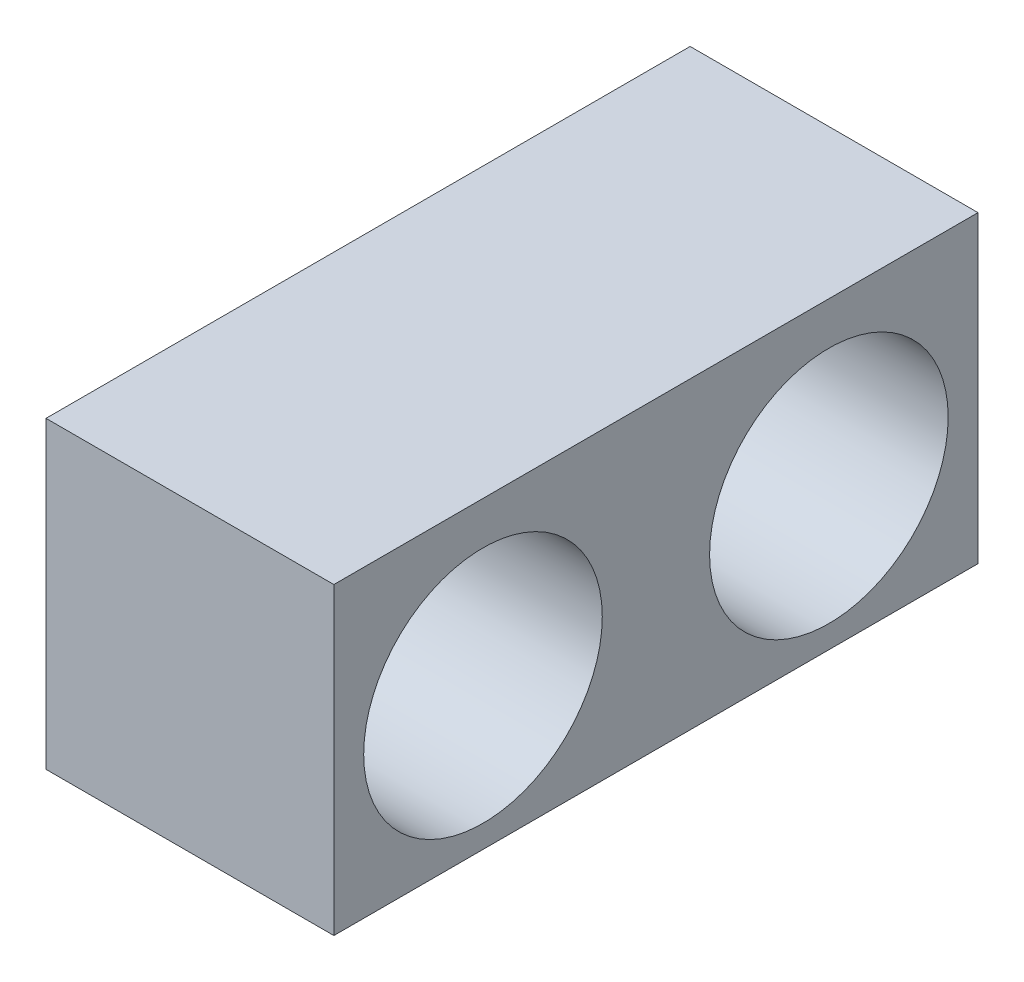
ISO-10303-21;
HEADER;
FILE_DESCRIPTION(('STEP AP214'),'2;1');
FILE_NAME('part.step','',(''),(''),'','','');
FILE_SCHEMA(('AUTOMOTIVE_DESIGN { 1 0 10303 214 1 1 1 1 }'));
ENDSEC;
DATA;
#1=APPLICATION_CONTEXT('core data for automotive mechanical design processes');
#2=APPLICATION_PROTOCOL_DEFINITION('international standard','automotive_design',2000,#1);
#3=PRODUCT_CONTEXT('',#1,'mechanical');
#4=PRODUCT('Part','Part','',(#3));
#5=PRODUCT_RELATED_PRODUCT_CATEGORY('part','',(#4));
#6=PRODUCT_DEFINITION_FORMATION('','',#4);
#7=PRODUCT_DEFINITION_CONTEXT('part definition',#1,'design');
#8=PRODUCT_DEFINITION('design','',#6,#7);
#9=PRODUCT_DEFINITION_SHAPE('','',#8);
#10=(LENGTH_UNIT() NAMED_UNIT(*) SI_UNIT(.MILLI.,.METRE.));
#11=(NAMED_UNIT(*) PLANE_ANGLE_UNIT() SI_UNIT($,.RADIAN.));
#12=(NAMED_UNIT(*) SI_UNIT($,.STERADIAN.) SOLID_ANGLE_UNIT());
#13=UNCERTAINTY_MEASURE_WITH_UNIT(LENGTH_MEASURE(1.E-05),#10,'distance_accuracy_value','');
#14=(GEOMETRIC_REPRESENTATION_CONTEXT(3) GLOBAL_UNCERTAINTY_ASSIGNED_CONTEXT((#13)) GLOBAL_UNIT_ASSIGNED_CONTEXT((#10,
#11,#12)) REPRESENTATION_CONTEXT('',''));
#15=CARTESIAN_POINT('',(0.,0.,0.));
#16=DIRECTION('',(0.,0.,1.));
#17=DIRECTION('',(1.,0.,0.));
#18=AXIS2_PLACEMENT_3D('',#15,#16,#17);
#19=CARTESIAN_POINT('',(0.,0.,0.));
#20=DIRECTION('',(0.,1.,0.));
#21=DIRECTION('',(0.,0.,1.));
#22=AXIS2_PLACEMENT_3D('',#19,#20,#21);
#23=PLANE('',#22);
#24=DIRECTION('',(1.,0.,0.));
#25=VECTOR('',#24,1.);
#26=CARTESIAN_POINT('',(-22.2000000000004,0.,49.6756858019915));
#27=LINE('',#26,#25);
#28=CARTESIAN_POINT('',(-22.2000000000004,0.,49.6756858019915));
#29=VERTEX_POINT('',#28);
#30=CARTESIAN_POINT('',(22.2,0.,49.6756858019916));
#31=VERTEX_POINT('',#30);
#32=EDGE_CURVE('E60',#29,#31,#27,.T.);
#33=ORIENTED_EDGE('',*,*,#32,.F.);
#34=DIRECTION('',(0.,0.,1.));
#35=VECTOR('',#34,1.);
#36=CARTESIAN_POINT('',(-22.2000000000004,0.,49.6756858019915));
#37=LINE('',#36,#35);
#38=CARTESIAN_POINT('',(-22.2000000000004,0.,-49.6756858019915));
#39=VERTEX_POINT('',#38);
#40=EDGE_CURVE('E98',#39,#29,#37,.T.);
#41=ORIENTED_EDGE('',*,*,#40,.F.);
#42=DIRECTION('',(-1.,0.,0.));
#43=VECTOR('',#42,1.);
#44=CARTESIAN_POINT('',(-22.2000000000004,0.,-49.6756858019915));
#45=LINE('',#44,#43);
#46=CARTESIAN_POINT('',(22.2000000000007,0.,-49.6756858019913));
#47=VERTEX_POINT('',#46);
#48=EDGE_CURVE('E93',#47,#39,#45,.T.);
#49=ORIENTED_EDGE('',*,*,#48,.F.);
#50=DIRECTION('',(0.,0.,-1.));
#51=VECTOR('',#50,1.);
#52=CARTESIAN_POINT('',(22.2000000000007,0.,-49.6756858019913));
#53=LINE('',#52,#51);
#54=EDGE_CURVE('E101',#31,#47,#53,.T.);
#55=ORIENTED_EDGE('',*,*,#54,.F.);
#56=EDGE_LOOP('',(#33,#41,#49,#55));
#57=FACE_BOUND('',#56,.T.);
#58=ADVANCED_FACE('F36',(#57),#23,.F.);
#59=CARTESIAN_POINT('',(-22.2000000000004,0.,49.6756858019915));
#60=DIRECTION('',(0.,0.,1.));
#61=DIRECTION('',(1.,0.,0.));
#62=AXIS2_PLACEMENT_3D('',#59,#60,#61);
#63=PLANE('',#62);
#64=DIRECTION('',(1.,0.,0.));
#65=VECTOR('',#64,1.);
#66=CARTESIAN_POINT('',(-22.2000000000004,46.8908443894375,49.6756858019915));
#67=LINE('',#66,#65);
#68=CARTESIAN_POINT('',(-22.2000000000004,46.8908443894375,49.6756858019915));
#69=VERTEX_POINT('',#68);
#70=CARTESIAN_POINT('',(22.2,46.8908443894375,49.6756858019916));
#71=VERTEX_POINT('',#70);
#72=EDGE_CURVE('E52',#69,#71,#67,.T.);
#73=ORIENTED_EDGE('',*,*,#72,.F.);
#74=DIRECTION('',(0.,1.,0.));
#75=VECTOR('',#74,1.);
#76=CARTESIAN_POINT('',(-22.2000000000004,0.,49.6756858019915));
#77=LINE('',#76,#75);
#78=EDGE_CURVE('E12',#29,#69,#77,.T.);
#79=ORIENTED_EDGE('',*,*,#78,.F.);
#80=ORIENTED_EDGE('',*,*,#32,.T.);
#81=DIRECTION('',(0.,1.,0.));
#82=VECTOR('',#81,1.);
#83=CARTESIAN_POINT('',(22.2,0.,49.6756858019916));
#84=LINE('',#83,#82);
#85=EDGE_CURVE('E39',#31,#71,#84,.T.);
#86=ORIENTED_EDGE('',*,*,#85,.T.);
#87=EDGE_LOOP('',(#73,#79,#80,#86));
#88=FACE_BOUND('',#87,.T.);
#89=ADVANCED_FACE('F132',(#88),#63,.T.);
#90=CARTESIAN_POINT('',(-22.2000000000004,0.,49.6756858019915));
#91=DIRECTION('',(-1.,0.,0.));
#92=DIRECTION('',(0.,0.,1.));
#93=AXIS2_PLACEMENT_3D('',#90,#91,#92);
#94=PLANE('',#93);
#95=CARTESIAN_POINT('',(-22.2000000000004,21.8908443894375,-26.6756858019914));
#96=DIRECTION('',(-1.,0.,0.));
#97=DIRECTION('',(0.,0.,1.));
#98=AXIS2_PLACEMENT_3D('',#95,#96,#97);
#99=CIRCLE('',#98,18.3999999999994);
#100=CARTESIAN_POINT('',(-22.2000000000004,21.8908443894375,-8.27568580199201));
#101=VERTEX_POINT('',#100);
#102=EDGE_CURVE('E114',#101,#101,#99,.T.);
#103=ORIENTED_EDGE('',*,*,#102,.F.);
#104=EDGE_LOOP('',(#103));
#105=FACE_BOUND('',#104,.T.);
#106=CARTESIAN_POINT('',(-22.2000000000004,21.8908443894375,26.6756858019916));
#107=DIRECTION('',(-1.,0.,0.));
#108=DIRECTION('',(0.,0.,1.));
#109=AXIS2_PLACEMENT_3D('',#106,#107,#108);
#110=CIRCLE('',#109,18.4000000000006);
#111=CARTESIAN_POINT('',(-22.2000000000004,21.8908443894375,45.0756858019923));
#112=VERTEX_POINT('',#111);
#113=EDGE_CURVE('E108',#112,#112,#110,.T.);
#114=ORIENTED_EDGE('',*,*,#113,.F.);
#115=EDGE_LOOP('',(#114));
#116=FACE_BOUND('',#115,.T.);
#117=DIRECTION('',(0.,0.,1.));
#118=VECTOR('',#117,1.);
#119=CARTESIAN_POINT('',(-22.2000000000004,46.8908443894375,-49.6756858019915));
#120=LINE('',#119,#118);
#121=CARTESIAN_POINT('',(-22.2000000000004,46.8908443894375,-49.6756858019915));
#122=VERTEX_POINT('',#121);
#123=EDGE_CURVE('E80',#122,#69,#120,.T.);
#124=ORIENTED_EDGE('',*,*,#123,.F.);
#125=DIRECTION('',(0.,1.,0.));
#126=VECTOR('',#125,1.);
#127=CARTESIAN_POINT('',(-22.2000000000004,0.,-49.6756858019915));
#128=LINE('',#127,#126);
#129=EDGE_CURVE('E44',#39,#122,#128,.T.);
#130=ORIENTED_EDGE('',*,*,#129,.F.);
#131=ORIENTED_EDGE('',*,*,#40,.T.);
#132=ORIENTED_EDGE('',*,*,#78,.T.);
#133=EDGE_LOOP('',(#124,#130,#131,#132));
#134=FACE_BOUND('',#133,.T.);
#135=ADVANCED_FACE('F87',(#105,#116,#134),#94,.T.);
#136=CARTESIAN_POINT('',(-22.2000000000004,0.,-49.6756858019915));
#137=DIRECTION('',(0.,0.,-1.));
#138=DIRECTION('',(-1.,0.,0.));
#139=AXIS2_PLACEMENT_3D('',#136,#137,#138);
#140=PLANE('',#139);
#141=DIRECTION('',(1.,0.,0.));
#142=VECTOR('',#141,1.);
#143=CARTESIAN_POINT('',(-22.2000000000004,46.8908443894375,-49.6756858019915));
#144=LINE('',#143,#142);
#145=CARTESIAN_POINT('',(22.2,46.8908443894375,-49.6756858019915));
#146=VERTEX_POINT('',#145);
#147=EDGE_CURVE('E77',#122,#146,#144,.T.);
#148=ORIENTED_EDGE('',*,*,#147,.T.);
#149=DIRECTION('',(0.,1.,0.));
#150=VECTOR('',#149,1.);
#151=CARTESIAN_POINT('',(22.2000000000007,0.,-49.6756858019913));
#152=LINE('',#151,#150);
#153=EDGE_CURVE('E95',#47,#146,#152,.T.);
#154=ORIENTED_EDGE('',*,*,#153,.F.);
#155=ORIENTED_EDGE('',*,*,#48,.T.);
#156=ORIENTED_EDGE('',*,*,#129,.T.);
#157=EDGE_LOOP('',(#148,#154,#155,#156));
#158=FACE_BOUND('',#157,.T.);
#159=ADVANCED_FACE('F91',(#158),#140,.T.);
#160=CARTESIAN_POINT('',(22.2000000000007,0.,-49.6756858019913));
#161=DIRECTION('',(1.,0.,0.));
#162=DIRECTION('',(0.,0.,-1.));
#163=AXIS2_PLACEMENT_3D('',#160,#161,#162);
#164=PLANE('',#163);
#165=CARTESIAN_POINT('',(22.2000000000007,21.8908443894375,-26.6756858019914));
#166=DIRECTION('',(-1.,0.,0.));
#167=DIRECTION('',(0.,0.,1.));
#168=AXIS2_PLACEMENT_3D('',#165,#166,#167);
#169=CIRCLE('',#168,18.3999999999994);
#170=CARTESIAN_POINT('',(22.2000000000007,21.8908443894375,-8.27568580199201));
#171=VERTEX_POINT('',#170);
#172=EDGE_CURVE('E111',#171,#171,#169,.T.);
#173=ORIENTED_EDGE('',*,*,#172,.T.);
#174=EDGE_LOOP('',(#173));
#175=FACE_BOUND('',#174,.T.);
#176=CARTESIAN_POINT('',(22.2000000000007,21.8908443894375,26.6756858019916));
#177=DIRECTION('',(-1.,0.,0.));
#178=DIRECTION('',(0.,0.,1.));
#179=AXIS2_PLACEMENT_3D('',#176,#177,#178);
#180=CIRCLE('',#179,18.4000000000006);
#181=CARTESIAN_POINT('',(22.2000000000007,21.8908443894375,45.0756858019923));
#182=VERTEX_POINT('',#181);
#183=EDGE_CURVE('E106',#182,#182,#180,.T.);
#184=ORIENTED_EDGE('',*,*,#183,.T.);
#185=EDGE_LOOP('',(#184));
#186=FACE_BOUND('',#185,.T.);
#187=DIRECTION('',(0.,0.,1.));
#188=VECTOR('',#187,1.);
#189=CARTESIAN_POINT('',(22.2,46.8908443894375,-49.6756858019915));
#190=LINE('',#189,#188);
#191=EDGE_CURVE('E81',#146,#71,#190,.T.);
#192=ORIENTED_EDGE('',*,*,#191,.T.);
#193=ORIENTED_EDGE('',*,*,#85,.F.);
#194=ORIENTED_EDGE('',*,*,#54,.T.);
#195=ORIENTED_EDGE('',*,*,#153,.T.);
#196=EDGE_LOOP('',(#192,#193,#194,#195));
#197=FACE_BOUND('',#196,.T.);
#198=ADVANCED_FACE('F120',(#175,#186,#197),#164,.T.);
#199=CARTESIAN_POINT('',(-22.2000000000004,46.8908443894375,-49.6756858019915));
#200=DIRECTION('',(0.,-1.,0.));
#201=DIRECTION('',(0.,0.,-1.));
#202=AXIS2_PLACEMENT_3D('',#199,#200,#201);
#203=PLANE('',#202);
#204=ORIENTED_EDGE('',*,*,#72,.T.);
#205=ORIENTED_EDGE('',*,*,#191,.F.);
#206=ORIENTED_EDGE('',*,*,#147,.F.);
#207=ORIENTED_EDGE('',*,*,#123,.T.);
#208=EDGE_LOOP('',(#204,#205,#206,#207));
#209=FACE_BOUND('',#208,.T.);
#210=ADVANCED_FACE('F79',(#209),#203,.F.);
#211=CARTESIAN_POINT('',(22.2000000000007,21.8908443894375,26.6756858019916));
#212=DIRECTION('',(-1.,0.,0.));
#213=DIRECTION('',(0.,0.,1.));
#214=AXIS2_PLACEMENT_3D('',#211,#212,#213);
#215=CYLINDRICAL_SURFACE('',#214,18.4000000000006);
#216=CARTESIAN_POINT('',(22.2000000000007,21.8908443894375,45.0756858019923));
#217=CARTESIAN_POINT('',(21.7375000000007,21.8908443894375,45.0756858019923));
#218=CARTESIAN_POINT('',(21.2750000000007,21.8908443894375,45.0756858019923));
#219=CARTESIAN_POINT('',(20.3500000000007,21.8908443894375,45.0756858019923));
#220=CARTESIAN_POINT('',(19.8875000000007,21.8908443894375,45.0756858019923));
#221=CARTESIAN_POINT('',(18.9625000000007,21.8908443894375,45.0756858019923));
#222=CARTESIAN_POINT('',(18.5000000000006,21.8908443894375,45.0756858019923));
#223=CARTESIAN_POINT('',(17.5750000000006,21.8908443894375,45.0756858019923));
#224=CARTESIAN_POINT('',(17.1125000000006,21.8908443894375,45.0756858019923));
#225=CARTESIAN_POINT('',(16.1875000000006,21.8908443894375,45.0756858019923));
#226=CARTESIAN_POINT('',(15.7250000000006,21.8908443894375,45.0756858019923));
#227=CARTESIAN_POINT('',(14.8000000000005,21.8908443894375,45.0756858019923));
#228=CARTESIAN_POINT('',(14.3375000000005,21.8908443894375,45.0756858019923));
#229=CARTESIAN_POINT('',(13.4125000000005,21.8908443894375,45.0756858019923));
#230=CARTESIAN_POINT('',(12.9500000000005,21.8908443894375,45.0756858019923));
#231=CARTESIAN_POINT('',(12.0250000000005,21.8908443894375,45.0756858019923));
#232=CARTESIAN_POINT('',(11.5625000000005,21.8908443894375,45.0756858019923));
#233=CARTESIAN_POINT('',(10.6375000000004,21.8908443894375,45.0756858019923));
#234=CARTESIAN_POINT('',(10.1750000000004,21.8908443894375,45.0756858019923));
#235=CARTESIAN_POINT('',(9.25000000000041,21.8908443894375,45.0756858019923));
#236=CARTESIAN_POINT('',(8.7875000000004,21.8908443894375,45.0756858019923));
#237=CARTESIAN_POINT('',(7.86250000000038,21.8908443894375,45.0756858019923));
#238=CARTESIAN_POINT('',(7.40000000000036,21.8908443894375,45.0756858019923));
#239=CARTESIAN_POINT('',(6.47500000000034,21.8908443894375,45.0756858019923));
#240=CARTESIAN_POINT('',(6.01250000000033,21.8908443894375,45.0756858019923));
#241=CARTESIAN_POINT('',(5.08750000000031,21.8908443894375,45.0756858019923));
#242=CARTESIAN_POINT('',(4.6250000000003,21.8908443894375,45.0756858019923));
#243=CARTESIAN_POINT('',(3.70000000000027,21.8908443894375,45.0756858019923));
#244=CARTESIAN_POINT('',(3.23750000000026,21.8908443894375,45.0756858019923));
#245=CARTESIAN_POINT('',(2.31250000000024,21.8908443894375,45.0756858019923));
#246=CARTESIAN_POINT('',(1.85000000000023,21.8908443894375,45.0756858019923));
#247=CARTESIAN_POINT('',(0.925000000000204,21.8908443894375,45.0756858019923));
#248=CARTESIAN_POINT('',(0.462500000000192,21.8908443894375,45.0756858019923));
#249=CARTESIAN_POINT('',(-0.462499999999831,21.8908443894375,45.0756858019923));
#250=CARTESIAN_POINT('',(-0.924999999999843,21.8908443894375,45.0756858019923));
#251=CARTESIAN_POINT('',(-1.84999999999987,21.8908443894375,45.0756858019923));
#252=CARTESIAN_POINT('',(-2.31249999999988,21.8908443894375,45.0756858019923));
#253=CARTESIAN_POINT('',(-3.2374999999999,21.8908443894375,45.0756858019923));
#254=CARTESIAN_POINT('',(-3.69999999999991,21.8908443894375,45.0756858019923));
#255=CARTESIAN_POINT('',(-4.62499999999993,21.8908443894375,45.0756858019923));
#256=CARTESIAN_POINT('',(-5.08749999999995,21.8908443894375,45.0756858019923));
#257=CARTESIAN_POINT('',(-6.01249999999997,21.8908443894375,45.0756858019923));
#258=CARTESIAN_POINT('',(-6.47499999999998,21.8908443894375,45.0756858019923));
#259=CARTESIAN_POINT('',(-7.40000000000001,21.8908443894375,45.0756858019923));
#260=CARTESIAN_POINT('',(-7.86250000000002,21.8908443894375,45.0756858019923));
#261=CARTESIAN_POINT('',(-8.78750000000004,21.8908443894375,45.0756858019923));
#262=CARTESIAN_POINT('',(-9.25000000000005,21.8908443894375,45.0756858019923));
#263=CARTESIAN_POINT('',(-10.1750000000001,21.8908443894375,45.0756858019923));
#264=CARTESIAN_POINT('',(-10.6375000000001,21.8908443894375,45.0756858019923));
#265=CARTESIAN_POINT('',(-11.5625000000001,21.8908443894375,45.0756858019923));
#266=CARTESIAN_POINT('',(-12.0250000000001,21.8908443894375,45.0756858019923));
#267=CARTESIAN_POINT('',(-12.9500000000001,21.8908443894375,45.0756858019923));
#268=CARTESIAN_POINT('',(-13.4125000000002,21.8908443894375,45.0756858019923));
#269=CARTESIAN_POINT('',(-14.3375000000002,21.8908443894375,45.0756858019923));
#270=CARTESIAN_POINT('',(-14.8000000000002,21.8908443894375,45.0756858019923));
#271=CARTESIAN_POINT('',(-15.7250000000002,21.8908443894375,45.0756858019923));
#272=CARTESIAN_POINT('',(-16.1875000000002,21.8908443894375,45.0756858019923));
#273=CARTESIAN_POINT('',(-17.1125000000003,21.8908443894375,45.0756858019923));
#274=CARTESIAN_POINT('',(-17.5750000000003,21.8908443894375,45.0756858019923));
#275=CARTESIAN_POINT('',(-18.5000000000003,21.8908443894375,45.0756858019923));
#276=CARTESIAN_POINT('',(-18.9625000000003,21.8908443894375,45.0756858019923));
#277=CARTESIAN_POINT('',(-19.8875000000003,21.8908443894375,45.0756858019923));
#278=CARTESIAN_POINT('',(-20.3500000000003,21.8908443894375,45.0756858019923));
#279=CARTESIAN_POINT('',(-21.2750000000004,21.8908443894375,45.0756858019923));
#280=CARTESIAN_POINT('',(-21.7375000000004,21.8908443894375,45.0756858019923));
#281=CARTESIAN_POINT('',(-22.2000000000004,21.8908443894375,45.0756858019923));
#282=B_SPLINE_CURVE_WITH_KNOTS('',3,(#216,#217,#218,#219,#220,#221,#222,#223,#224,#225,#226,
#227,#228,#229,#230,#231,#232,#233,#234,#235,#236,#237,#238,#239,#240,#241,#242,#243,#244,#245,
#246,#247,#248,#249,#250,#251,#252,#253,#254,#255,#256,#257,#258,#259,#260,#261,#262,#263,#264,
#265,#266,#267,#268,#269,#270,#271,#272,#273,#274,#275,#276,#277,#278,#279,#280,#281),
.UNSPECIFIED.,.F.,.F.,(4,2,2,2,2,2,2,2,2,2,2,2,2,2,2,2,2,2,2,2,2,2,2,2,2,2,2,2,2,2,2,2,4),(0.,
1.38750000000004,2.77500000000007,4.16250000000011,5.55000000000014,6.93750000000018,
8.32500000000021,9.71250000000025,11.1000000000003,12.4875000000003,13.8750000000003,
15.2625000000004,16.6500000000004,18.0375000000005,19.4250000000005,20.8125000000005,
22.2000000000006,23.5875000000006,24.9750000000006,26.3625000000007,27.7500000000007,
29.1375000000007,30.5250000000008,31.9125000000008,33.3000000000008,34.6875000000009,
36.0750000000009,37.4625000000009,38.850000000001,40.237500000001,41.6250000000011,
43.0125000000011,44.4000000000011),.UNSPECIFIED.);
#283=EDGE_CURVE('BSEAM126',#182,#112,#282,.T.);
#284=ORIENTED_EDGE('',*,*,#183,.F.);
#285=ORIENTED_EDGE('',*,*,#113,.T.);
#286=ORIENTED_EDGE('',*,*,#283,.T.);
#287=ORIENTED_EDGE('',*,*,#283,.F.);
#288=EDGE_LOOP('',(#284,#286,#285,#287));
#289=FACE_BOUND('',#288,.T.);
#290=ADVANCED_FACE('F126',(#289),#215,.F.);
#291=CARTESIAN_POINT('',(22.2000000000007,21.8908443894375,-26.6756858019914));
#292=DIRECTION('',(-1.,0.,0.));
#293=DIRECTION('',(0.,0.,1.));
#294=AXIS2_PLACEMENT_3D('',#291,#292,#293);
#295=CYLINDRICAL_SURFACE('',#294,18.3999999999994);
#296=CARTESIAN_POINT('',(22.2000000000007,21.8908443894375,-8.27568580199201));
#297=CARTESIAN_POINT('',(21.7375000000007,21.8908443894375,-8.27568580199201));
#298=CARTESIAN_POINT('',(21.2750000000007,21.8908443894375,-8.27568580199201));
#299=CARTESIAN_POINT('',(20.3500000000007,21.8908443894375,-8.27568580199201));
#300=CARTESIAN_POINT('',(19.8875000000007,21.8908443894375,-8.27568580199201));
#301=CARTESIAN_POINT('',(18.9625000000007,21.8908443894375,-8.27568580199201));
#302=CARTESIAN_POINT('',(18.5000000000006,21.8908443894375,-8.27568580199201));
#303=CARTESIAN_POINT('',(17.5750000000006,21.8908443894375,-8.27568580199201));
#304=CARTESIAN_POINT('',(17.1125000000006,21.8908443894375,-8.27568580199201));
#305=CARTESIAN_POINT('',(16.1875000000006,21.8908443894375,-8.27568580199201));
#306=CARTESIAN_POINT('',(15.7250000000006,21.8908443894375,-8.27568580199201));
#307=CARTESIAN_POINT('',(14.8000000000005,21.8908443894375,-8.27568580199201));
#308=CARTESIAN_POINT('',(14.3375000000005,21.8908443894375,-8.27568580199201));
#309=CARTESIAN_POINT('',(13.4125000000005,21.8908443894375,-8.27568580199201));
#310=CARTESIAN_POINT('',(12.9500000000005,21.8908443894375,-8.27568580199201));
#311=CARTESIAN_POINT('',(12.0250000000005,21.8908443894375,-8.27568580199201));
#312=CARTESIAN_POINT('',(11.5625000000005,21.8908443894375,-8.27568580199201));
#313=CARTESIAN_POINT('',(10.6375000000004,21.8908443894375,-8.27568580199201));
#314=CARTESIAN_POINT('',(10.1750000000004,21.8908443894375,-8.27568580199201));
#315=CARTESIAN_POINT('',(9.25000000000041,21.8908443894375,-8.27568580199201));
#316=CARTESIAN_POINT('',(8.7875000000004,21.8908443894375,-8.27568580199201));
#317=CARTESIAN_POINT('',(7.86250000000038,21.8908443894375,-8.27568580199201));
#318=CARTESIAN_POINT('',(7.40000000000036,21.8908443894375,-8.27568580199201));
#319=CARTESIAN_POINT('',(6.47500000000034,21.8908443894375,-8.27568580199201));
#320=CARTESIAN_POINT('',(6.01250000000033,21.8908443894375,-8.27568580199201));
#321=CARTESIAN_POINT('',(5.08750000000031,21.8908443894375,-8.27568580199201));
#322=CARTESIAN_POINT('',(4.6250000000003,21.8908443894375,-8.27568580199201));
#323=CARTESIAN_POINT('',(3.70000000000027,21.8908443894375,-8.27568580199201));
#324=CARTESIAN_POINT('',(3.23750000000026,21.8908443894375,-8.27568580199201));
#325=CARTESIAN_POINT('',(2.31250000000024,21.8908443894375,-8.27568580199201));
#326=CARTESIAN_POINT('',(1.85000000000023,21.8908443894375,-8.27568580199201));
#327=CARTESIAN_POINT('',(0.925000000000204,21.8908443894375,-8.27568580199201));
#328=CARTESIAN_POINT('',(0.462500000000192,21.8908443894375,-8.27568580199201));
#329=CARTESIAN_POINT('',(-0.462499999999831,21.8908443894375,-8.27568580199201));
#330=CARTESIAN_POINT('',(-0.924999999999843,21.8908443894375,-8.27568580199201));
#331=CARTESIAN_POINT('',(-1.84999999999987,21.8908443894375,-8.27568580199201));
#332=CARTESIAN_POINT('',(-2.31249999999988,21.8908443894375,-8.27568580199201));
#333=CARTESIAN_POINT('',(-3.2374999999999,21.8908443894375,-8.27568580199201));
#334=CARTESIAN_POINT('',(-3.69999999999991,21.8908443894375,-8.27568580199201));
#335=CARTESIAN_POINT('',(-4.62499999999993,21.8908443894375,-8.27568580199201));
#336=CARTESIAN_POINT('',(-5.08749999999995,21.8908443894375,-8.27568580199201));
#337=CARTESIAN_POINT('',(-6.01249999999997,21.8908443894375,-8.27568580199201));
#338=CARTESIAN_POINT('',(-6.47499999999998,21.8908443894375,-8.27568580199201));
#339=CARTESIAN_POINT('',(-7.40000000000001,21.8908443894375,-8.27568580199201));
#340=CARTESIAN_POINT('',(-7.86250000000002,21.8908443894375,-8.27568580199201));
#341=CARTESIAN_POINT('',(-8.78750000000004,21.8908443894375,-8.27568580199201));
#342=CARTESIAN_POINT('',(-9.25000000000005,21.8908443894375,-8.27568580199201));
#343=CARTESIAN_POINT('',(-10.1750000000001,21.8908443894375,-8.27568580199201));
#344=CARTESIAN_POINT('',(-10.6375000000001,21.8908443894375,-8.27568580199201));
#345=CARTESIAN_POINT('',(-11.5625000000001,21.8908443894375,-8.27568580199201));
#346=CARTESIAN_POINT('',(-12.0250000000001,21.8908443894375,-8.27568580199201));
#347=CARTESIAN_POINT('',(-12.9500000000001,21.8908443894375,-8.27568580199201));
#348=CARTESIAN_POINT('',(-13.4125000000002,21.8908443894375,-8.27568580199201));
#349=CARTESIAN_POINT('',(-14.3375000000002,21.8908443894375,-8.27568580199201));
#350=CARTESIAN_POINT('',(-14.8000000000002,21.8908443894375,-8.27568580199201));
#351=CARTESIAN_POINT('',(-15.7250000000002,21.8908443894375,-8.27568580199201));
#352=CARTESIAN_POINT('',(-16.1875000000002,21.8908443894375,-8.27568580199201));
#353=CARTESIAN_POINT('',(-17.1125000000003,21.8908443894375,-8.27568580199201));
#354=CARTESIAN_POINT('',(-17.5750000000003,21.8908443894375,-8.27568580199201));
#355=CARTESIAN_POINT('',(-18.5000000000003,21.8908443894375,-8.27568580199201));
#356=CARTESIAN_POINT('',(-18.9625000000003,21.8908443894375,-8.27568580199201));
#357=CARTESIAN_POINT('',(-19.8875000000003,21.8908443894375,-8.27568580199201));
#358=CARTESIAN_POINT('',(-20.3500000000003,21.8908443894375,-8.27568580199201));
#359=CARTESIAN_POINT('',(-21.2750000000004,21.8908443894375,-8.27568580199201));
#360=CARTESIAN_POINT('',(-21.7375000000004,21.8908443894375,-8.27568580199201));
#361=CARTESIAN_POINT('',(-22.2000000000004,21.8908443894375,-8.27568580199201));
#362=B_SPLINE_CURVE_WITH_KNOTS('',3,(#296,#297,#298,#299,#300,#301,#302,#303,#304,#305,#306,
#307,#308,#309,#310,#311,#312,#313,#314,#315,#316,#317,#318,#319,#320,#321,#322,#323,#324,#325,
#326,#327,#328,#329,#330,#331,#332,#333,#334,#335,#336,#337,#338,#339,#340,#341,#342,#343,#344,
#345,#346,#347,#348,#349,#350,#351,#352,#353,#354,#355,#356,#357,#358,#359,#360,#361),
.UNSPECIFIED.,.F.,.F.,(4,2,2,2,2,2,2,2,2,2,2,2,2,2,2,2,2,2,2,2,2,2,2,2,2,2,2,2,2,2,2,2,4),(0.,
1.38750000000004,2.77500000000007,4.16250000000011,5.55000000000014,6.93750000000018,
8.32500000000021,9.71250000000025,11.1000000000003,12.4875000000003,13.8750000000003,
15.2625000000004,16.6500000000004,18.0375000000005,19.4250000000005,20.8125000000005,
22.2000000000006,23.5875000000006,24.9750000000006,26.3625000000007,27.7500000000007,
29.1375000000007,30.5250000000008,31.9125000000008,33.3000000000008,34.6875000000009,
36.0750000000009,37.4625000000009,38.850000000001,40.237500000001,41.6250000000011,
43.0125000000011,44.4000000000011),.UNSPECIFIED.);
#363=EDGE_CURVE('BSEAM123',#171,#101,#362,.T.);
#364=ORIENTED_EDGE('',*,*,#172,.F.);
#365=ORIENTED_EDGE('',*,*,#102,.T.);
#366=ORIENTED_EDGE('',*,*,#363,.T.);
#367=ORIENTED_EDGE('',*,*,#363,.F.);
#368=EDGE_LOOP('',(#364,#366,#365,#367));
#369=FACE_BOUND('',#368,.T.);
#370=ADVANCED_FACE('F123',(#369),#295,.F.);
#371=CLOSED_SHELL('',(#58,#89,#135,#159,#198,#210,#290,#370));
#372=MANIFOLD_SOLID_BREP('B2',#371);
#373=ADVANCED_BREP_SHAPE_REPRESENTATION('',(#18,#372),#14);
#374=SHAPE_DEFINITION_REPRESENTATION(#9,#373);
ENDSEC;
END-ISO-10303-21;
